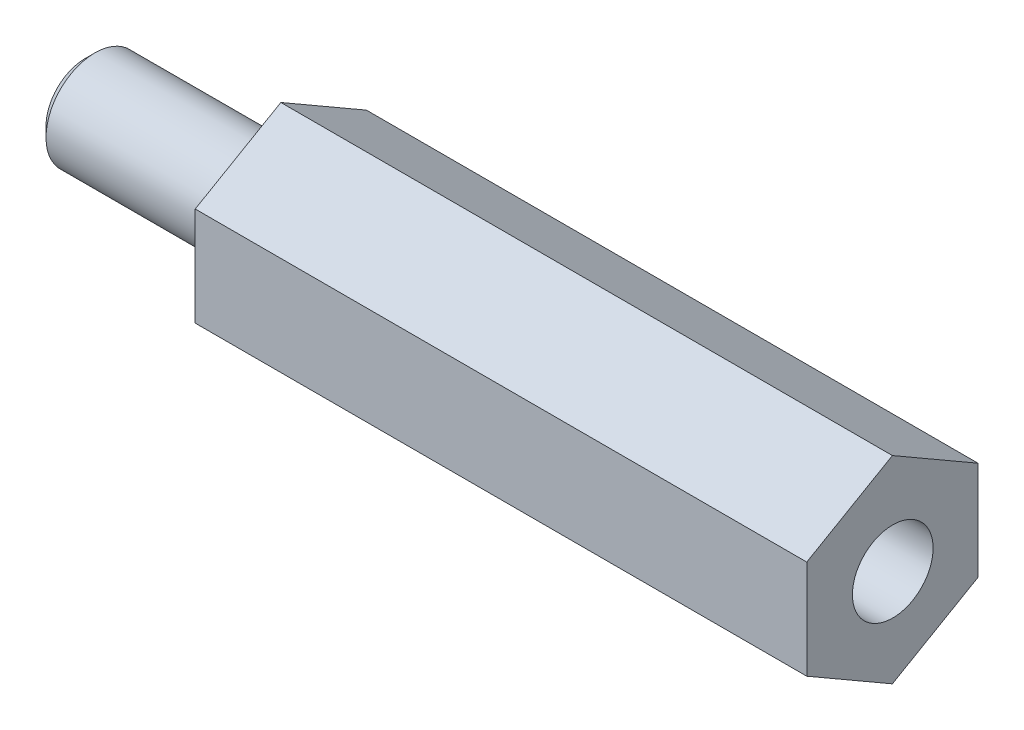
ISO-10303-21;
HEADER;
FILE_DESCRIPTION(('STEP AP214'),'2;1');
FILE_NAME('part.step','',(''),(''),'','','');
FILE_SCHEMA(('AUTOMOTIVE_DESIGN { 1 0 10303 214 1 1 1 1 }'));
ENDSEC;
DATA;
#1=APPLICATION_CONTEXT('core data for automotive mechanical design processes');
#2=APPLICATION_PROTOCOL_DEFINITION('international standard','automotive_design',2000,#1);
#3=PRODUCT_CONTEXT('',#1,'mechanical');
#4=PRODUCT('Part','Part','',(#3));
#5=PRODUCT_RELATED_PRODUCT_CATEGORY('part','',(#4));
#6=PRODUCT_DEFINITION_FORMATION('','',#4);
#7=PRODUCT_DEFINITION_CONTEXT('part definition',#1,'design');
#8=PRODUCT_DEFINITION('design','',#6,#7);
#9=PRODUCT_DEFINITION_SHAPE('','',#8);
#10=(LENGTH_UNIT() NAMED_UNIT(*) SI_UNIT(.MILLI.,.METRE.));
#11=(NAMED_UNIT(*) PLANE_ANGLE_UNIT() SI_UNIT($,.RADIAN.));
#12=(NAMED_UNIT(*) SI_UNIT($,.STERADIAN.) SOLID_ANGLE_UNIT());
#13=UNCERTAINTY_MEASURE_WITH_UNIT(LENGTH_MEASURE(1.E-05),#10,'distance_accuracy_value','');
#14=(GEOMETRIC_REPRESENTATION_CONTEXT(3) GLOBAL_UNCERTAINTY_ASSIGNED_CONTEXT((#13)) GLOBAL_UNIT_ASSIGNED_CONTEXT((#10,
#11,#12)) REPRESENTATION_CONTEXT('',''));
#15=CARTESIAN_POINT('',(0.,0.,0.));
#16=DIRECTION('',(0.,0.,1.));
#17=DIRECTION('',(1.,0.,0.));
#18=AXIS2_PLACEMENT_3D('',#15,#16,#17);
#19=CARTESIAN_POINT('',(15.,-0.068295067,-0.015228416));
#20=DIRECTION('',(1.,0.,0.));
#21=DIRECTION('',(0.,1.,0.));
#22=AXIS2_PLACEMENT_3D('',#19,#20,#21);
#23=CYLINDRICAL_SURFACE('',#22,1.65);
#24=CARTESIAN_POINT('',(15.,-0.068295067,-0.015228416));
#25=DIRECTION('',(-1.,0.,0.));
#26=DIRECTION('',(0.,0.,-1.));
#27=AXIS2_PLACEMENT_3D('',#24,#25,#26);
#28=CIRCLE('',#27,1.65);
#29=CARTESIAN_POINT('',(15.,-1.718295067,-0.0152284159999998));
#30=VERTEX_POINT('',#29);
#31=EDGE_CURVE('E9',#30,#30,#28,.T.);
#32=ORIENTED_EDGE('',*,*,#31,.T.);
#33=EDGE_LOOP('',(#32));
#34=FACE_BOUND('',#33,.T.);
#35=CARTESIAN_POINT('',(25.,-0.0682950669999948,-0.015228416));
#36=DIRECTION('',(1.,0.,0.));
#37=DIRECTION('',(0.,1.,0.));
#38=AXIS2_PLACEMENT_3D('',#35,#36,#37);
#39=CIRCLE('',#38,1.65);
#40=CARTESIAN_POINT('',(25.,1.581704933,-0.015228416));
#41=VERTEX_POINT('',#40);
#42=EDGE_CURVE('E25',#41,#41,#39,.T.);
#43=ORIENTED_EDGE('',*,*,#42,.T.);
#44=EDGE_LOOP('',(#43));
#45=FACE_BOUND('',#44,.T.);
#46=ADVANCED_FACE('F15',(#34,#45),#23,.F.);
#47=CARTESIAN_POINT('',(1014.008579979,-0.0682950669994744,-0.015228416));
#48=DIRECTION('',(1.,0.,0.));
#49=DIRECTION('',(0.,1.,0.));
#50=AXIS2_PLACEMENT_3D('',#47,#48,#49);
#51=CONICAL_SURFACE('',#50,1664.2794830144,1.02974425885276);
#52=ORIENTED_EDGE('',*,*,#31,.F.);
#53=EDGE_LOOP('',(#52));
#54=FACE_BOUND('',#53,.T.);
#55=CARTESIAN_POINT('',(14.008579979,-0.068295067,-0.0152284160000002));
#56=VERTEX_POINT('',#55);
#57=VERTEX_LOOP('',#56);
#58=FACE_BOUND('',#57,.T.);
#59=ADVANCED_FACE('F276',(#54,#58),#51,.F.);
#60=CARTESIAN_POINT('',(0.,0.,0.));
#61=DIRECTION('',(-1.,0.,0.));
#62=DIRECTION('',(0.,0.,1.));
#63=AXIS2_PLACEMENT_3D('',#60,#61,#62);
#64=CYLINDRICAL_SURFACE('',#63,1.6);
#65=CARTESIAN_POINT('',(0.,0.,0.));
#66=DIRECTION('',(-1.,0.,0.));
#67=DIRECTION('',(0.,0.,1.));
#68=AXIS2_PLACEMENT_3D('',#65,#66,#67);
#69=CIRCLE('',#68,1.6);
#70=CARTESIAN_POINT('',(0.,0.,-1.6));
#71=VERTEX_POINT('',#70);
#72=EDGE_CURVE('E73',#71,#71,#69,.T.);
#73=ORIENTED_EDGE('',*,*,#72,.T.);
#74=EDGE_LOOP('',(#73));
#75=FACE_BOUND('',#74,.T.);
#76=CARTESIAN_POINT('',(-0.5,0.,0.));
#77=DIRECTION('',(-1.,0.,0.));
#78=DIRECTION('',(0.,0.,1.));
#79=AXIS2_PLACEMENT_3D('',#76,#77,#78);
#80=CIRCLE('',#79,1.6);
#81=CARTESIAN_POINT('',(-0.5,0.,1.6));
#82=VERTEX_POINT('',#81);
#83=EDGE_CURVE('E19',#82,#82,#80,.T.);
#84=ORIENTED_EDGE('',*,*,#83,.F.);
#85=EDGE_LOOP('',(#84));
#86=FACE_BOUND('',#85,.T.);
#87=ADVANCED_FACE('F311',(#75,#86),#64,.T.);
#88=CARTESIAN_POINT('',(-0.5,0.,0.));
#89=DIRECTION('',(-1.,0.,0.));
#90=DIRECTION('',(0.,0.,1.));
#91=AXIS2_PLACEMENT_3D('',#88,#89,#90);
#92=CONICAL_SURFACE('',#91,1.6,0.785398163397448);
#93=ORIENTED_EDGE('',*,*,#83,.T.);
#94=EDGE_LOOP('',(#93));
#95=FACE_BOUND('',#94,.T.);
#96=CARTESIAN_POINT('',(-0.899999999999901,0.,0.));
#97=DIRECTION('',(-1.,0.,0.));
#98=DIRECTION('',(0.,0.,1.));
#99=AXIS2_PLACEMENT_3D('',#96,#97,#98);
#100=CIRCLE('',#99,2.);
#101=CARTESIAN_POINT('',(-0.9,0.,2.));
#102=VERTEX_POINT('',#101);
#103=EDGE_CURVE('E183',#102,#102,#100,.T.);
#104=ORIENTED_EDGE('',*,*,#103,.F.);
#105=EDGE_LOOP('',(#104));
#106=FACE_BOUND('',#105,.T.);
#107=ADVANCED_FACE('F333',(#95,#106),#92,.T.);
#108=CARTESIAN_POINT('',(-0.9,0.,0.));
#109=DIRECTION('',(-1.,0.,0.));
#110=DIRECTION('',(0.,0.,1.));
#111=AXIS2_PLACEMENT_3D('',#108,#109,#110);
#112=CYLINDRICAL_SURFACE('',#111,2.);
#113=ORIENTED_EDGE('',*,*,#103,.T.);
#114=EDGE_LOOP('',(#113));
#115=FACE_BOUND('',#114,.T.);
#116=CARTESIAN_POINT('',(-7.6,0.,0.));
#117=DIRECTION('',(-1.,0.,0.));
#118=DIRECTION('',(0.,0.,1.));
#119=AXIS2_PLACEMENT_3D('',#116,#117,#118);
#120=CIRCLE('',#119,2.);
#121=CARTESIAN_POINT('',(-7.6,0.,2.));
#122=VERTEX_POINT('',#121);
#123=EDGE_CURVE('E175',#122,#122,#120,.T.);
#124=ORIENTED_EDGE('',*,*,#123,.F.);
#125=EDGE_LOOP('',(#124));
#126=FACE_BOUND('',#125,.T.);
#127=ADVANCED_FACE('F287',(#115,#126),#112,.T.);
#128=CARTESIAN_POINT('',(-8.,0.,0.));
#129=DIRECTION('',(1.,0.,0.));
#130=DIRECTION('',(0.,0.,-1.));
#131=AXIS2_PLACEMENT_3D('',#128,#129,#130);
#132=CONICAL_SURFACE('',#131,1.6,0.785398163397448);
#133=CARTESIAN_POINT('',(-8.,0.,0.));
#134=DIRECTION('',(-1.,0.,0.));
#135=DIRECTION('',(0.,0.,-1.));
#136=AXIS2_PLACEMENT_3D('',#133,#134,#135);
#137=CIRCLE('',#136,1.6);
#138=CARTESIAN_POINT('',(-8.,0.,-1.6));
#139=VERTEX_POINT('',#138);
#140=EDGE_CURVE('E172',#139,#139,#137,.T.);
#141=ORIENTED_EDGE('',*,*,#140,.F.);
#142=EDGE_LOOP('',(#141));
#143=FACE_BOUND('',#142,.T.);
#144=ORIENTED_EDGE('',*,*,#123,.T.);
#145=EDGE_LOOP('',(#144));
#146=FACE_BOUND('',#145,.T.);
#147=ADVANCED_FACE('F282',(#143,#146),#132,.T.);
#148=CARTESIAN_POINT('',(-8.,-1.6192,1.6192));
#149=DIRECTION('',(1.,0.,0.));
#150=DIRECTION('',(0.,1.,0.));
#151=AXIS2_PLACEMENT_3D('',#148,#149,#150);
#152=PLANE('',#151);
#153=ORIENTED_EDGE('',*,*,#140,.T.);
#154=EDGE_LOOP('',(#153));
#155=FACE_BOUND('',#154,.T.);
#156=ADVANCED_FACE('F286',(#155),#152,.F.);
#157=CARTESIAN_POINT('',(0.,-4.089949307,3.5));
#158=DIRECTION('',(1.,0.,0.));
#159=DIRECTION('',(0.,1.,0.));
#160=AXIS2_PLACEMENT_3D('',#157,#158,#159);
#161=PLANE('',#160);
#162=DIRECTION('',(0.,-1.,0.));
#163=VECTOR('',#162,1.);
#164=CARTESIAN_POINT('',(0.,0.,-3.5));
#165=LINE('',#164,#163);
#166=CARTESIAN_POINT('',(0.,2.02072594179785,-3.5));
#167=VERTEX_POINT('',#166);
#168=CARTESIAN_POINT('',(0.,-2.02072594179785,-3.5));
#169=VERTEX_POINT('',#168);
#170=EDGE_CURVE('E176',#167,#169,#165,.T.);
#171=ORIENTED_EDGE('',*,*,#170,.T.);
#172=DIRECTION('',(0.,-0.499999999969623,0.866025403801977));
#173=VECTOR('',#172,1.);
#174=CARTESIAN_POINT('',(0.,-3.031088913,-1.75));
#175=LINE('',#174,#173);
#176=CARTESIAN_POINT('',(0.,-4.04145188302546,9.87682429332698E-10));
#177=VERTEX_POINT('',#176);
#178=EDGE_CURVE('E187',#169,#177,#175,.T.);
#179=ORIENTED_EDGE('',*,*,#178,.T.);
#180=DIRECTION('',(0.,0.499999999969623,0.866025403801977));
#181=VECTOR('',#180,1.);
#182=CARTESIAN_POINT('',(0.,-3.031088913,1.75));
#183=LINE('',#182,#181);
#184=CARTESIAN_POINT('',(0.,-2.02072594179785,3.5));
#185=VERTEX_POINT('',#184);
#186=EDGE_CURVE('E140',#177,#185,#183,.T.);
#187=ORIENTED_EDGE('',*,*,#186,.T.);
#188=DIRECTION('',(0.,1.,0.));
#189=VECTOR('',#188,1.);
#190=CARTESIAN_POINT('',(0.,0.,3.5));
#191=LINE('',#190,#189);
#192=CARTESIAN_POINT('',(0.,2.02072594179785,3.5));
#193=VERTEX_POINT('',#192);
#194=EDGE_CURVE('E170',#185,#193,#191,.T.);
#195=ORIENTED_EDGE('',*,*,#194,.T.);
#196=DIRECTION('',(0.,0.499999999969623,-0.866025403801977));
#197=VECTOR('',#196,1.);
#198=CARTESIAN_POINT('',(0.,3.031088913,1.75));
#199=LINE('',#198,#197);
#200=CARTESIAN_POINT('',(0.,4.04145188302546,9.87682537752915E-10));
#201=VERTEX_POINT('',#200);
#202=EDGE_CURVE('E167',#193,#201,#199,.T.);
#203=ORIENTED_EDGE('',*,*,#202,.T.);
#204=DIRECTION('',(0.,-0.499999999969623,-0.866025403801977));
#205=VECTOR('',#204,1.);
#206=CARTESIAN_POINT('',(0.,3.031088913,-1.75));
#207=LINE('',#206,#205);
#208=EDGE_CURVE('E171',#201,#167,#207,.T.);
#209=ORIENTED_EDGE('',*,*,#208,.T.);
#210=EDGE_LOOP('',(#171,#179,#187,#195,#203,#209));
#211=FACE_BOUND('',#210,.T.);
#212=ORIENTED_EDGE('',*,*,#72,.F.);
#213=EDGE_LOOP('',(#212));
#214=FACE_BOUND('',#213,.T.);
#215=ADVANCED_FACE('F249',(#211,#214),#161,.F.);
#216=CARTESIAN_POINT('',(0.,4.041451884,0.));
#217=DIRECTION('',(0.,-0.866025403801977,0.499999999969623));
#218=DIRECTION('',(-1.,0.,0.));
#219=AXIS2_PLACEMENT_3D('',#216,#217,#218);
#220=PLANE('',#219);
#221=DIRECTION('',(1.,0.,0.));
#222=VECTOR('',#221,1.);
#223=CARTESIAN_POINT('',(12.5,4.041451884,0.));
#224=LINE('',#223,#222);
#225=CARTESIAN_POINT('',(25.,4.04145188288817,1.75067452938895E-10));
#226=VERTEX_POINT('',#225);
#227=EDGE_CURVE('E164',#201,#226,#224,.T.);
#228=ORIENTED_EDGE('',*,*,#227,.T.);
#229=DIRECTION('',(0.,0.499999999819565,0.866025403888613));
#230=VECTOR('',#229,1.);
#231=CARTESIAN_POINT('',(25.,2.0207259411914,-3.5));
#232=LINE('',#231,#230);
#233=CARTESIAN_POINT('',(25.,2.0207259415957,-3.5));
#234=VERTEX_POINT('',#233);
#235=EDGE_CURVE('E99',#234,#226,#232,.T.);
#236=ORIENTED_EDGE('',*,*,#235,.F.);
#237=DIRECTION('',(-1.,0.,0.));
#238=VECTOR('',#237,1.);
#239=CARTESIAN_POINT('',(12.5,2.020725942,-3.5));
#240=LINE('',#239,#238);
#241=EDGE_CURVE('E201',#234,#167,#240,.T.);
#242=ORIENTED_EDGE('',*,*,#241,.T.);
#243=ORIENTED_EDGE('',*,*,#208,.F.);
#244=EDGE_LOOP('',(#228,#236,#242,#243));
#245=FACE_BOUND('',#244,.T.);
#246=ADVANCED_FACE('F303',(#245),#220,.F.);
#247=CARTESIAN_POINT('',(0.,2.020725942,3.5));
#248=DIRECTION('',(0.,-0.866025403801977,-0.499999999969623));
#249=DIRECTION('',(0.,0.499999999969623,-0.866025403801977));
#250=AXIS2_PLACEMENT_3D('',#247,#248,#249);
#251=PLANE('',#250);
#252=DIRECTION('',(1.,0.,0.));
#253=VECTOR('',#252,1.);
#254=CARTESIAN_POINT('',(12.5,2.020725942,3.5));
#255=LINE('',#254,#253);
#256=CARTESIAN_POINT('',(25.,2.0207259415957,3.5));
#257=VERTEX_POINT('',#256);
#258=EDGE_CURVE('E204',#193,#257,#255,.T.);
#259=ORIENTED_EDGE('',*,*,#258,.T.);
#260=DIRECTION('',(0.,-0.499999999819565,0.866025403888613));
#261=VECTOR('',#260,1.);
#262=CARTESIAN_POINT('',(25.,4.04145188238279,0.));
#263=LINE('',#262,#261);
#264=EDGE_CURVE('E200',#226,#257,#263,.T.);
#265=ORIENTED_EDGE('',*,*,#264,.F.);
#266=ORIENTED_EDGE('',*,*,#227,.F.);
#267=ORIENTED_EDGE('',*,*,#202,.F.);
#268=EDGE_LOOP('',(#259,#265,#266,#267));
#269=FACE_BOUND('',#268,.T.);
#270=ADVANCED_FACE('F229',(#269),#251,.F.);
#271=CARTESIAN_POINT('',(0.,-2.020725942,3.5));
#272=DIRECTION('',(0.,0.,-1.));
#273=DIRECTION('',(0.,-1.,0.));
#274=AXIS2_PLACEMENT_3D('',#271,#272,#273);
#275=PLANE('',#274);
#276=DIRECTION('',(1.,0.,0.));
#277=VECTOR('',#276,1.);
#278=CARTESIAN_POINT('',(12.5,-2.020725942,3.5));
#279=LINE('',#278,#277);
#280=CARTESIAN_POINT('',(25.,-2.0207259415957,3.5));
#281=VERTEX_POINT('',#280);
#282=EDGE_CURVE('E145',#185,#281,#279,.T.);
#283=ORIENTED_EDGE('',*,*,#282,.T.);
#284=DIRECTION('',(0.,-1.,0.));
#285=VECTOR('',#284,1.);
#286=CARTESIAN_POINT('',(25.,0.,3.5));
#287=LINE('',#286,#285);
#288=EDGE_CURVE('E130',#257,#281,#287,.T.);
#289=ORIENTED_EDGE('',*,*,#288,.F.);
#290=ORIENTED_EDGE('',*,*,#258,.F.);
#291=ORIENTED_EDGE('',*,*,#194,.F.);
#292=EDGE_LOOP('',(#283,#289,#290,#291));
#293=FACE_BOUND('',#292,.T.);
#294=ADVANCED_FACE('F233',(#293),#275,.F.);
#295=CARTESIAN_POINT('',(0.,-4.041451884,0.));
#296=DIRECTION('',(0.,0.866025403801977,-0.499999999969623));
#297=DIRECTION('',(-1.,0.,0.));
#298=AXIS2_PLACEMENT_3D('',#295,#296,#297);
#299=PLANE('',#298);
#300=DIRECTION('',(1.,0.,0.));
#301=VECTOR('',#300,1.);
#302=CARTESIAN_POINT('',(12.5,-4.041451884,0.));
#303=LINE('',#302,#301);
#304=CARTESIAN_POINT('',(25.,-4.04145188288817,-1.75067886619765E-10));
#305=VERTEX_POINT('',#304);
#306=EDGE_CURVE('E137',#177,#305,#303,.T.);
#307=ORIENTED_EDGE('',*,*,#306,.T.);
#308=DIRECTION('',(0.,-0.499999999819565,-0.866025403888613));
#309=VECTOR('',#308,1.);
#310=CARTESIAN_POINT('',(25.,-2.02072594119139,3.5));
#311=LINE('',#310,#309);
#312=EDGE_CURVE('E124',#281,#305,#311,.T.);
#313=ORIENTED_EDGE('',*,*,#312,.F.);
#314=ORIENTED_EDGE('',*,*,#282,.F.);
#315=ORIENTED_EDGE('',*,*,#186,.F.);
#316=EDGE_LOOP('',(#307,#313,#314,#315));
#317=FACE_BOUND('',#316,.T.);
#318=ADVANCED_FACE('F138',(#317),#299,.F.);
#319=CARTESIAN_POINT('',(0.,-2.020725942,-3.5));
#320=DIRECTION('',(0.,0.866025403801977,0.499999999969623));
#321=DIRECTION('',(1.,0.,0.));
#322=AXIS2_PLACEMENT_3D('',#319,#320,#321);
#323=PLANE('',#322);
#324=DIRECTION('',(1.,0.,0.));
#325=VECTOR('',#324,1.);
#326=CARTESIAN_POINT('',(12.5,-2.020725942,-3.5));
#327=LINE('',#326,#325);
#328=CARTESIAN_POINT('',(25.,-2.0207259415957,-3.5));
#329=VERTEX_POINT('',#328);
#330=EDGE_CURVE('E146',#169,#329,#327,.T.);
#331=ORIENTED_EDGE('',*,*,#330,.T.);
#332=DIRECTION('',(0.,0.499999999819565,-0.866025403888613));
#333=VECTOR('',#332,1.);
#334=CARTESIAN_POINT('',(25.,-4.04145188238279,0.));
#335=LINE('',#334,#333);
#336=EDGE_CURVE('E127',#305,#329,#335,.T.);
#337=ORIENTED_EDGE('',*,*,#336,.F.);
#338=ORIENTED_EDGE('',*,*,#306,.F.);
#339=ORIENTED_EDGE('',*,*,#178,.F.);
#340=EDGE_LOOP('',(#331,#337,#338,#339));
#341=FACE_BOUND('',#340,.T.);
#342=ADVANCED_FACE('F148',(#341),#323,.F.);
#343=CARTESIAN_POINT('',(0.,2.020725942,-3.5));
#344=DIRECTION('',(0.,0.,1.));
#345=DIRECTION('',(1.,0.,0.));
#346=AXIS2_PLACEMENT_3D('',#343,#344,#345);
#347=PLANE('',#346);
#348=ORIENTED_EDGE('',*,*,#241,.F.);
#349=DIRECTION('',(0.,1.,0.));
#350=VECTOR('',#349,1.);
#351=CARTESIAN_POINT('',(25.,0.,-3.5));
#352=LINE('',#351,#350);
#353=EDGE_CURVE('E152',#329,#234,#352,.T.);
#354=ORIENTED_EDGE('',*,*,#353,.F.);
#355=ORIENTED_EDGE('',*,*,#330,.F.);
#356=ORIENTED_EDGE('',*,*,#170,.F.);
#357=EDGE_LOOP('',(#348,#354,#355,#356));
#358=FACE_BOUND('',#357,.T.);
#359=ADVANCED_FACE('F372',(#358),#347,.F.);
#360=CARTESIAN_POINT('',(25.,-4.089949307,3.5));
#361=DIRECTION('',(1.,0.,0.));
#362=DIRECTION('',(0.,1.,0.));
#363=AXIS2_PLACEMENT_3D('',#360,#361,#362);
#364=PLANE('',#363);
#365=ORIENTED_EDGE('',*,*,#336,.T.);
#366=ORIENTED_EDGE('',*,*,#353,.T.);
#367=ORIENTED_EDGE('',*,*,#235,.T.);
#368=ORIENTED_EDGE('',*,*,#264,.T.);
#369=ORIENTED_EDGE('',*,*,#288,.T.);
#370=ORIENTED_EDGE('',*,*,#312,.T.);
#371=EDGE_LOOP('',(#365,#366,#367,#368,#369,#370));
#372=FACE_BOUND('',#371,.T.);
#373=ORIENTED_EDGE('',*,*,#42,.F.);
#374=EDGE_LOOP('',(#373));
#375=FACE_BOUND('',#374,.T.);
#376=ADVANCED_FACE('F17',(#372,#375),#364,.T.);
#377=CLOSED_SHELL('',(#46,#59,#87,#107,#127,#147,#156,#215,#246,#270,#294,#318,#342,#359,#376));
#378=MANIFOLD_SOLID_BREP('B1',#377);
#379=ADVANCED_BREP_SHAPE_REPRESENTATION('',(#18,#378),#14);
#380=SHAPE_DEFINITION_REPRESENTATION(#9,#379);
ENDSEC;
END-ISO-10303-21;
